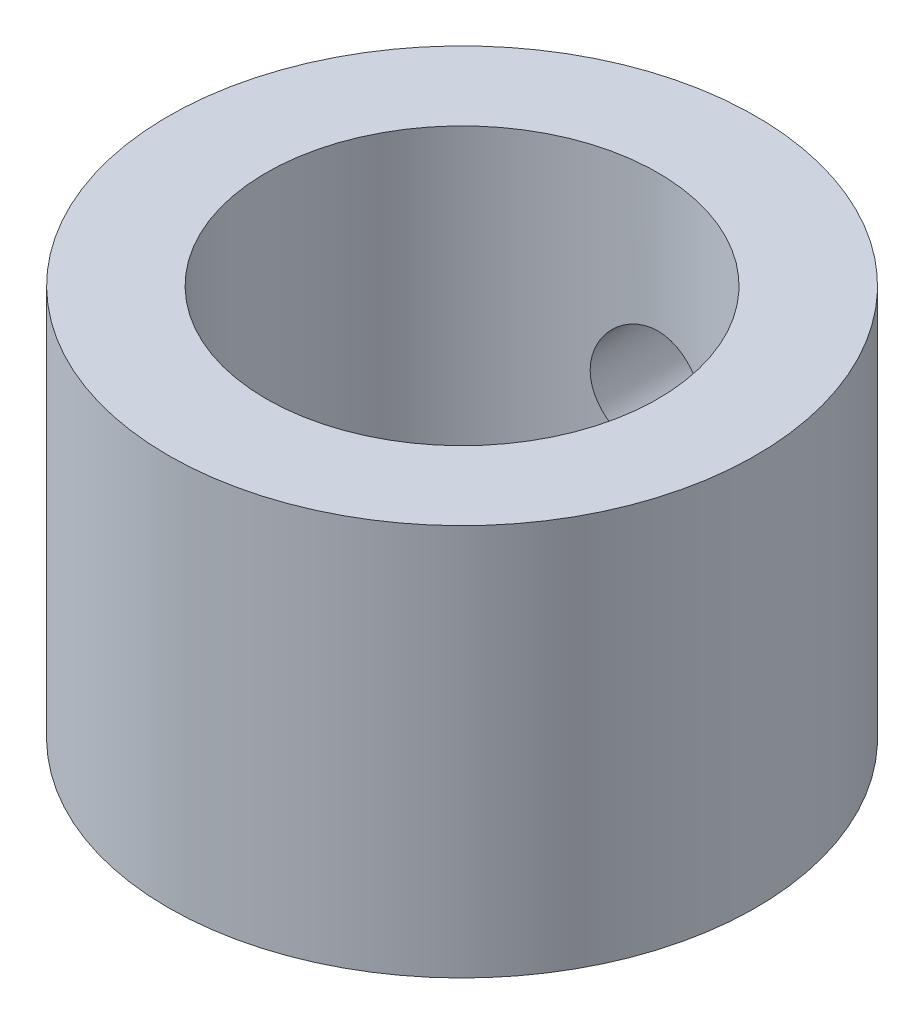
ISO-10303-21;
HEADER;
FILE_DESCRIPTION(('STEP AP214'),'2;1');
FILE_NAME('part.step','',(''),(''),'','','');
FILE_SCHEMA(('AUTOMOTIVE_DESIGN { 1 0 10303 214 1 1 1 1 }'));
ENDSEC;
DATA;
#1=APPLICATION_CONTEXT('core data for automotive mechanical design processes');
#2=APPLICATION_PROTOCOL_DEFINITION('international standard','automotive_design',2000,#1);
#3=PRODUCT_CONTEXT('',#1,'mechanical');
#4=PRODUCT('Part','Part','',(#3));
#5=PRODUCT_RELATED_PRODUCT_CATEGORY('part','',(#4));
#6=PRODUCT_DEFINITION_FORMATION('','',#4);
#7=PRODUCT_DEFINITION_CONTEXT('part definition',#1,'design');
#8=PRODUCT_DEFINITION('design','',#6,#7);
#9=PRODUCT_DEFINITION_SHAPE('','',#8);
#10=(LENGTH_UNIT() NAMED_UNIT(*) SI_UNIT(.MILLI.,.METRE.));
#11=(NAMED_UNIT(*) PLANE_ANGLE_UNIT() SI_UNIT($,.RADIAN.));
#12=(NAMED_UNIT(*) SI_UNIT($,.STERADIAN.) SOLID_ANGLE_UNIT());
#13=UNCERTAINTY_MEASURE_WITH_UNIT(LENGTH_MEASURE(1.E-05),#10,'distance_accuracy_value','');
#14=(GEOMETRIC_REPRESENTATION_CONTEXT(3) GLOBAL_UNCERTAINTY_ASSIGNED_CONTEXT((#13)) GLOBAL_UNIT_ASSIGNED_CONTEXT((#10,
#11,#12)) REPRESENTATION_CONTEXT('',''));
#15=CARTESIAN_POINT('',(0.,0.,0.));
#16=DIRECTION('',(0.,0.,1.));
#17=DIRECTION('',(1.,0.,0.));
#18=AXIS2_PLACEMENT_3D('',#15,#16,#17);
#19=CARTESIAN_POINT('',(0.,5.,0.));
#20=DIRECTION('',(0.,1.,0.));
#21=DIRECTION('',(0.,0.,1.));
#22=AXIS2_PLACEMENT_3D('',#19,#20,#21);
#23=PLANE('',#22);
#24=CARTESIAN_POINT('',(0.,5.,0.));
#25=DIRECTION('',(0.,1.,0.));
#26=DIRECTION('',(0.,0.,1.));
#27=AXIS2_PLACEMENT_3D('',#24,#25,#26);
#28=CIRCLE('',#27,7.5);
#29=CARTESIAN_POINT('',(0.,5.,7.5));
#30=VERTEX_POINT('',#29);
#31=EDGE_CURVE('E10',#30,#30,#28,.T.);
#32=ORIENTED_EDGE('',*,*,#31,.T.);
#33=EDGE_LOOP('',(#32));
#34=FACE_BOUND('',#33,.T.);
#35=CARTESIAN_POINT('',(0.,5.,0.));
#36=DIRECTION('',(0.,1.,0.));
#37=DIRECTION('',(0.,0.,1.));
#38=AXIS2_PLACEMENT_3D('',#35,#36,#37);
#39=CIRCLE('',#38,5.);
#40=CARTESIAN_POINT('',(0.,5.,5.));
#41=VERTEX_POINT('',#40);
#42=EDGE_CURVE('E47',#41,#41,#39,.T.);
#43=ORIENTED_EDGE('',*,*,#42,.F.);
#44=EDGE_LOOP('',(#43));
#45=FACE_BOUND('',#44,.T.);
#46=ADVANCED_FACE('F30',(#34,#45),#23,.T.);
#47=CARTESIAN_POINT('',(0.,-5.,0.));
#48=DIRECTION('',(0.,1.,0.));
#49=DIRECTION('',(0.,0.,1.));
#50=AXIS2_PLACEMENT_3D('',#47,#48,#49);
#51=PLANE('',#50);
#52=CARTESIAN_POINT('',(0.,-5.,0.));
#53=DIRECTION('',(0.,1.,0.));
#54=DIRECTION('',(0.,0.,1.));
#55=AXIS2_PLACEMENT_3D('',#52,#53,#54);
#56=CIRCLE('',#55,7.5);
#57=CARTESIAN_POINT('',(0.,-5.,7.5));
#58=VERTEX_POINT('',#57);
#59=EDGE_CURVE('E42',#58,#58,#56,.T.);
#60=ORIENTED_EDGE('',*,*,#59,.F.);
#61=EDGE_LOOP('',(#60));
#62=FACE_BOUND('',#61,.T.);
#63=CARTESIAN_POINT('',(0.,-5.,0.));
#64=DIRECTION('',(0.,1.,0.));
#65=DIRECTION('',(0.,0.,1.));
#66=AXIS2_PLACEMENT_3D('',#63,#64,#65);
#67=CIRCLE('',#66,5.);
#68=CARTESIAN_POINT('',(0.,-5.,5.));
#69=VERTEX_POINT('',#68);
#70=EDGE_CURVE('E49',#69,#69,#67,.T.);
#71=ORIENTED_EDGE('',*,*,#70,.T.);
#72=EDGE_LOOP('',(#71));
#73=FACE_BOUND('',#72,.T.);
#74=ADVANCED_FACE('F68',(#62,#73),#51,.F.);
#75=CARTESIAN_POINT('',(0.,5.,0.));
#76=DIRECTION('',(0.,-1.,0.));
#77=DIRECTION('',(0.,0.,-1.));
#78=AXIS2_PLACEMENT_3D('',#75,#76,#77);
#79=CYLINDRICAL_SURFACE('',#78,7.5);
#80=CARTESIAN_POINT('',(1.5,0.,-7.34846922834954));
#81=CARTESIAN_POINT('',(1.49999691881235,-0.0833465632357616,-7.34847088538349));
#82=CARTESIAN_POINT('',(1.49302975757707,-0.16673193499975,-7.34990262402619));
#83=CARTESIAN_POINT('',(1.46536842537441,-0.331143757714958,-7.35546646957747));
#84=CARTESIAN_POINT('',(1.44466327060578,-0.41216826695404,-7.35960073717297));
#85=CARTESIAN_POINT('',(1.39019367392958,-0.569455955031247,-7.37008310582666));
#86=CARTESIAN_POINT('',(1.35644222122892,-0.645723782298866,-7.37642900431582));
#87=CARTESIAN_POINT('',(1.27687366150577,-0.791512267045452,-7.39061699221019));
#88=CARTESIAN_POINT('',(1.23105722790173,-0.861033300806858,-7.398458998102));
#89=CARTESIAN_POINT('',(1.12796861348015,-0.992341505780786,-7.4148794954137));
#90=CARTESIAN_POINT('',(1.07055848386998,-1.05401938182596,-7.42346606755867));
#91=CARTESIAN_POINT('',(0.946210183531966,-1.16693630036847,-7.440337084539));
#92=CARTESIAN_POINT('',(0.879271345466976,-1.21817461112579,-7.44862150816248));
#93=CARTESIAN_POINT('',(0.737042033886383,-1.30918202644269,-7.46404194626342));
#94=CARTESIAN_POINT('',(0.661683851508316,-1.34884727072496,-7.47116732162326));
#95=CARTESIAN_POINT('',(0.505206225580907,-1.41491240557221,-7.48337605325447));
#96=CARTESIAN_POINT('',(0.424087322130829,-1.44131353785149,-7.48845960066179));
#97=CARTESIAN_POINT('',(0.259525159917741,-1.47976079042944,-7.49595481032628));
#98=CARTESIAN_POINT('',(0.176126608822221,-1.49199146635651,-7.49840079432191));
#99=CARTESIAN_POINT('',(0.0084278526563047,-1.50232642775747,-7.50046381775405));
#100=CARTESIAN_POINT('',(-0.0758722647477646,-1.50043207446873,-7.50008112979138));
#101=CARTESIAN_POINT('',(-0.241713001115383,-1.48271072967667,-7.49655652302773));
#102=CARTESIAN_POINT('',(-0.323275821447705,-1.46708253424823,-7.49345397548757));
#103=CARTESIAN_POINT('',(-0.482597439870452,-1.42265245131166,-7.48488265739113));
#104=CARTESIAN_POINT('',(-0.560356085620694,-1.39385003671219,-7.47941379216059));
#105=CARTESIAN_POINT('',(-0.710429194801331,-1.3237049397791,-7.46665944029938));
#106=CARTESIAN_POINT('',(-0.78270626120085,-1.28228437334267,-7.45936272262835));
#107=CARTESIAN_POINT('',(-0.919357568789634,-1.1881363841451,-7.44375704210678));
#108=CARTESIAN_POINT('',(-0.983730899287501,-1.13540766034423,-7.43544796282833));
#109=CARTESIAN_POINT('',(-1.10392714658019,-1.01904956683729,-7.4185644654669));
#110=CARTESIAN_POINT('',(-1.15958147486045,-0.955246219905615,-7.40998794686274));
#111=CARTESIAN_POINT('',(-1.25942773976521,-0.819125336323872,-7.39367357398141));
#112=CARTESIAN_POINT('',(-1.30361945959163,-0.746807638675207,-7.38593573556822));
#113=CARTESIAN_POINT('',(-1.37934422220282,-0.595468752267293,-7.37217071209386));
#114=CARTESIAN_POINT('',(-1.41084997166656,-0.516433548540508,-7.36614722345324));
#115=CARTESIAN_POINT('',(-1.46008551244137,-0.354043014414014,-7.35654714481909));
#116=CARTESIAN_POINT('',(-1.47781709918496,-0.270688248571374,-7.35297023592642));
#117=CARTESIAN_POINT('',(-1.49874900905408,-0.103552713001433,-7.34873218901742));
#118=CARTESIAN_POINT('',(-1.50219278834687,-0.0198036385344892,-7.34802220585731));
#119=CARTESIAN_POINT('',(-1.49510644246611,0.147072334799525,-7.34946728533281));
#120=CARTESIAN_POINT('',(-1.48457710968366,0.230199268678295,-7.35162218550582));
#121=CARTESIAN_POINT('',(-1.45005331211124,0.392652960438353,-7.35850848742372));
#122=CARTESIAN_POINT('',(-1.42618893125895,0.472008514553644,-7.36321498521745));
#123=CARTESIAN_POINT('',(-1.36581155296278,0.625594918543112,-7.37465234027497));
#124=CARTESIAN_POINT('',(-1.32929751355977,0.699825345653581,-7.38138336429404));
#125=CARTESIAN_POINT('',(-1.2441062133234,0.842119664925242,-7.39622108943059));
#126=CARTESIAN_POINT('',(-1.19527661697413,0.91009056945124,-7.40434457797355));
#127=CARTESIAN_POINT('',(-1.08704335831907,1.03696246800137,-7.42100585739955));
#128=CARTESIAN_POINT('',(-1.02763860771681,1.09586252737388,-7.42954369085727));
#129=CARTESIAN_POINT('',(-0.898848410246836,1.20384383877837,-7.44623018803823));
#130=CARTESIAN_POINT('',(-0.829323748394445,1.25276048197499,-7.45437086563026));
#131=CARTESIAN_POINT('',(-0.682901844952133,1.33821882224938,-7.4692069144293));
#132=CARTESIAN_POINT('',(-0.606004913150261,1.37476103901717,-7.47590234632816));
#133=CARTESIAN_POINT('',(-0.447454021236019,1.43419330761995,-7.487059410916));
#134=CARTESIAN_POINT('',(-0.365830010217117,1.45716077733938,-7.49153368713907));
#135=CARTESIAN_POINT('',(-0.199784182019869,1.48903687149577,-7.4977985390649));
#136=CARTESIAN_POINT('',(-0.115362703066821,1.49794718921352,-7.49958943799765));
#137=CARTESIAN_POINT('',(0.0523093408554348,1.50139047144433,-7.50027810681181));
#138=CARTESIAN_POINT('',(0.135554718212253,1.49617092068432,-7.49922567824026));
#139=CARTESIAN_POINT('',(0.299956546973462,1.47204907417828,-7.49445065340477));
#140=CARTESIAN_POINT('',(0.381113024630536,1.45314695047789,-7.49072809071528));
#141=CARTESIAN_POINT('',(0.538879124617644,1.40230651186253,-7.481032475475));
#142=CARTESIAN_POINT('',(0.61549866486042,1.37039793280322,-7.47506455871866));
#143=CARTESIAN_POINT('',(0.762331830278928,1.29448163800365,-7.46152083185077));
#144=CARTESIAN_POINT('',(0.832544948651117,1.25047296614443,-7.45394489468828));
#145=CARTESIAN_POINT('',(0.965795835159535,1.15077091940688,-7.43786398736791));
#146=CARTESIAN_POINT('',(1.02869957417475,1.09490049541984,-7.4293460013317));
#147=CARTESIAN_POINT('',(1.14432392663527,0.973424639856349,-7.41241834355477));
#148=CARTESIAN_POINT('',(1.19704212480408,0.907816905796931,-7.40400869794476));
#149=CARTESIAN_POINT('',(1.29133832918279,0.767881024949695,-7.3881501412478));
#150=CARTESIAN_POINT('',(1.33279022195961,0.693466558259309,-7.38071255446371));
#151=CARTESIAN_POINT('',(1.40253607393175,0.538600840050603,-7.36777855777287));
#152=CARTESIAN_POINT('',(1.43084196896908,0.458155141953656,-7.36228038807749));
#153=CARTESIAN_POINT('',(1.4680037097813,0.314606316844753,-7.3549452169166));
#154=CARTESIAN_POINT('',(1.47998084778413,0.252321870731514,-7.35253177367824));
#155=CARTESIAN_POINT('',(1.49598002694097,0.126699068170847,-7.34929317692711));
#156=CARTESIAN_POINT('',(1.50000234234439,0.0633607481325583,-7.34846796865859));
#157=CARTESIAN_POINT('',(1.5,0.,-7.34846922834954));
#158=B_SPLINE_CURVE_WITH_KNOTS('',3,(#80,#81,#82,#83,#84,#85,#86,#87,#88,#89,#90,#91,#92,#93,
#94,#95,#96,#97,#98,#99,#100,#101,#102,#103,#104,#105,#106,#107,#108,#109,#110,#111,#112,#113,
#114,#115,#116,#117,#118,#119,#120,#121,#122,#123,#124,#125,#126,#127,#128,#129,#130,#131,#132,
#133,#134,#135,#136,#137,#138,#139,#140,#141,#142,#143,#144,#145,#146,#147,#148,#149,#150,#151,
#152,#153,#154,#155,#156,#157),.UNSPECIFIED.,.T.,.F.,(4,2,2,2,2,2,2,2,2,2,2,2,2,2,2,2,2,2,2,2,2,
2,2,2,2,2,2,2,2,2,2,2,2,2,2,2,2,2,4),(0.,0.249807695804142,0.499815358926445,0.749574746910879,
0.999320197289796,1.25223378822655,1.50516510053133,1.76030100656175,2.0154130236984,
2.26716373324621,2.51889018174372,2.76703184450306,3.01518343610625,3.26489886333455,
3.51464303655099,3.76874020143725,4.0228421718408,4.27748794759165,4.53210052524037,
4.7823563670689,5.03259801792632,5.28044012674978,5.52830265531598,5.77939589661782,
6.03051499305313,6.28548902600176,6.54045234945157,6.79394720367975,7.04741152037442,
7.29646526122029,7.54551587050135,7.79400025613178,8.04250428202026,8.29501728038395,
8.54759008334672,8.80288347868562,9.05794462633399,9.24785705455344,9.43776293526322),.UNSPECIFIED.);
#159=CARTESIAN_POINT('',(1.5,0.,-7.34846922834954));
#160=VERTEX_POINT('',#159);
#161=EDGE_CURVE('E54',#160,#160,#158,.T.);
#162=ORIENTED_EDGE('',*,*,#161,.F.);
#163=EDGE_LOOP('',(#162));
#164=FACE_BOUND('',#163,.T.);
#165=ORIENTED_EDGE('',*,*,#31,.F.);
#166=EDGE_LOOP('',(#165));
#167=FACE_BOUND('',#166,.T.);
#168=ORIENTED_EDGE('',*,*,#59,.T.);
#169=EDGE_LOOP('',(#168));
#170=FACE_BOUND('',#169,.T.);
#171=ADVANCED_FACE('F32',(#164,#167,#170),#79,.T.);
#172=CARTESIAN_POINT('',(0.,5.,0.));
#173=DIRECTION('',(0.,-1.,0.));
#174=DIRECTION('',(0.,0.,-1.));
#175=AXIS2_PLACEMENT_3D('',#172,#173,#174);
#176=CYLINDRICAL_SURFACE('',#175,5.);
#177=CARTESIAN_POINT('',(0.,1.5,-5.));
#178=CARTESIAN_POINT('',(-0.0822886127533,1.49999900251511,-4.9999992925055));
#179=CARTESIAN_POINT('',(-0.164587318351529,1.49320613637603,-4.99794915693954));
#180=CARTESIAN_POINT('',(-0.326788125304881,1.4662786457779,-4.98997105593691));
#181=CARTESIAN_POINT('',(-0.40668950441142,1.44614004197666,-4.98404193389692));
#182=CARTESIAN_POINT('',(-0.561732707754526,1.39325398308974,-4.96895552501836));
#183=CARTESIAN_POINT('',(-0.636881364395373,1.36052513038106,-4.95980300250425));
#184=CARTESIAN_POINT('',(-0.780624181053131,1.28346390694416,-4.93922109237645));
#185=CARTESIAN_POINT('',(-0.849217467469669,1.23912999260458,-4.92779140192067));
#186=CARTESIAN_POINT('',(-0.979871797183745,1.13877599252733,-4.90350737192774));
#187=CARTESIAN_POINT('',(-1.04171807124434,1.08248337411409,-4.89062383657036));
#188=CARTESIAN_POINT('',(-1.15524920923324,0.960390770089816,-4.86505834210442));
#189=CARTESIAN_POINT('',(-1.20693236327441,0.89458918787504,-4.85237641724501));
#190=CARTESIAN_POINT('',(-1.29980037723708,0.753529246962388,-4.82834113993772));
#191=CARTESIAN_POINT('',(-1.34072309022213,0.678091539009262,-4.81702406663875));
#192=CARTESIAN_POINT('',(-1.4092139477476,0.521010745769707,-4.79743620394031));
#193=CARTESIAN_POINT('',(-1.43678529919973,0.439369156072024,-4.78916468313311));
#194=CARTESIAN_POINT('',(-1.47701633682652,0.27460973386954,-4.77690870838434));
#195=CARTESIAN_POINT('',(-1.49007196234677,0.191597256136057,-4.77281069324533));
#196=CARTESIAN_POINT('',(-1.50213730614672,0.0244668437832342,-4.76902789749767));
#197=CARTESIAN_POINT('',(-1.50115042761078,-0.0596508180590879,-4.76934204760571));
#198=CARTESIAN_POINT('',(-1.48546977199812,-0.223383908608484,-4.77424744067778));
#199=CARTESIAN_POINT('',(-1.47127205262685,-0.303052250362239,-4.7786838859914));
#200=CARTESIAN_POINT('',(-1.43037420427056,-0.458819786273461,-4.79108356228624));
#201=CARTESIAN_POINT('',(-1.40367284141641,-0.534918627374333,-4.79904714132351));
#202=CARTESIAN_POINT('',(-1.33816026653682,-0.68260034966074,-4.81772733074973));
#203=CARTESIAN_POINT('',(-1.29918816934642,-0.754107083955263,-4.82848016115952));
#204=CARTESIAN_POINT('',(-1.21035222588683,-0.889732022010193,-4.85150987000065));
#205=CARTESIAN_POINT('',(-1.16048574002588,-0.953848429413778,-4.86378711746991));
#206=CARTESIAN_POINT('',(-1.04881290765546,-1.07568619076202,-4.88911011297937));
#207=CARTESIAN_POINT('',(-0.986594907466972,-1.13302866402967,-4.90216654310498));
#208=CARTESIAN_POINT('',(-0.853263259313967,-1.23655398406425,-4.92712244063259));
#209=CARTESIAN_POINT('',(-0.782149051860887,-1.28273612841443,-4.9390218351841));
#210=CARTESIAN_POINT('',(-0.632355038342802,-1.36285992246473,-4.9604316006947));
#211=CARTESIAN_POINT('',(-0.553627749747949,-1.39671751624986,-4.96992543668314));
#212=CARTESIAN_POINT('',(-0.391245415603518,-1.45059959009963,-4.98533521832222));
#213=CARTESIAN_POINT('',(-0.307591751589581,-1.47062792853249,-4.99125216186999));
#214=CARTESIAN_POINT('',(-0.140952242668331,-1.49565217789939,-4.99868364643538));
#215=CARTESIAN_POINT('',(-0.0580500976011865,-1.50116158580161,-5.0003485041779));
#216=CARTESIAN_POINT('',(0.107499605823383,-1.49843084428792,-4.9995292324176));
#217=CARTESIAN_POINT('',(0.190147196690781,-1.49019253034856,-4.99704565677756));
#218=CARTESIAN_POINT('',(0.350903605309697,-1.4606153888885,-4.98830696987163));
#219=CARTESIAN_POINT('',(0.429072772614169,-1.43957661241913,-4.98213829799417));
#220=CARTESIAN_POINT('',(0.580754638954522,-1.3853567672218,-4.96674347841533));
#221=CARTESIAN_POINT('',(0.654266777025584,-1.35217423896214,-4.95751696321085));
#222=CARTESIAN_POINT('',(0.796437189461053,-1.27374683451887,-4.93669654351325));
#223=CARTESIAN_POINT('',(0.86494382619967,-1.22824065905203,-4.92505280829675));
#224=CARTESIAN_POINT('',(0.993523307980147,-1.12677524594719,-4.90073468764318));
#225=CARTESIAN_POINT('',(1.05359403235593,-1.07081338811233,-4.8880600443108));
#226=CARTESIAN_POINT('',(1.16585744551027,-0.947612691630654,-4.86253171869138));
#227=CARTESIAN_POINT('',(1.21768481231504,-0.880038124228263,-4.84968825033268));
#228=CARTESIAN_POINT('',(1.30928995072154,-0.736872060986467,-4.82576515238463));
#229=CARTESIAN_POINT('',(1.34906803829472,-0.661280775441786,-4.81468547654651));
#230=CARTESIAN_POINT('',(1.41517347127168,-0.504467508745312,-4.79567189615055));
#231=CARTESIAN_POINT('',(1.4415634693705,-0.423273813463409,-4.78772337843827));
#232=CARTESIAN_POINT('',(1.48021730815114,-0.257312031068522,-4.77591594362794));
#233=CARTESIAN_POINT('',(1.49248598978779,-0.172545179212331,-4.772055625083));
#234=CARTESIAN_POINT('',(1.50221984485059,-0.00563848162377221,-4.76899972496087));
#235=CARTESIAN_POINT('',(1.5002805530849,0.0764636510175858,-4.76961647442754));
#236=CARTESIAN_POINT('',(1.48307505444813,0.2391141033728,-4.77499401288294));
#237=CARTESIAN_POINT('',(1.46780938124716,0.319662485176353,-4.77975463592551));
#238=CARTESIAN_POINT('',(1.42476888804136,0.475945399142852,-4.79275763670386));
#239=CARTESIAN_POINT('',(1.39715175507068,0.551727287361693,-4.80095604545965));
#240=CARTESIAN_POINT('',(1.33031507121129,0.697642438817723,-4.81990278909136));
#241=CARTESIAN_POINT('',(1.29109329962876,0.767774617640757,-4.83065161194312));
#242=CARTESIAN_POINT('',(1.20048763805072,0.903163116527113,-4.85397676425833));
#243=CARTESIAN_POINT('',(1.14871276092994,0.968148761260411,-4.86660540163798));
#244=CARTESIAN_POINT('',(1.03517434629782,1.08870249830786,-4.89201320450026));
#245=CARTESIAN_POINT('',(0.973408217134502,1.14426813946776,-4.90479240823905));
#246=CARTESIAN_POINT('',(0.839465762183249,1.24602341229503,-4.92950936570649));
#247=CARTESIAN_POINT('',(0.767037885790608,1.29189144685549,-4.94141159765674));
#248=CARTESIAN_POINT('',(0.61514137398353,1.37073516990402,-4.96260680455813));
#249=CARTESIAN_POINT('',(0.535676052998955,1.40371688827451,-4.97190099931067));
#250=CARTESIAN_POINT('',(0.380757712655282,1.45289527565275,-4.98602174969301));
#251=CARTESIAN_POINT('',(0.305786961954234,1.47051167288325,-4.99122027381068));
#252=CARTESIAN_POINT('',(0.15388019523078,1.49406352524158,-4.99820944494492));
#253=CARTESIAN_POINT('',(0.0769445098581396,1.50000093270482,-5.0000006615474));
#254=CARTESIAN_POINT('',(0.,1.5,-5.));
#255=B_SPLINE_CURVE_WITH_KNOTS('',3,(#177,#178,#179,#180,#181,#182,#183,#184,#185,#186,#187,
#188,#189,#190,#191,#192,#193,#194,#195,#196,#197,#198,#199,#200,#201,#202,#203,#204,#205,#206,
#207,#208,#209,#210,#211,#212,#213,#214,#215,#216,#217,#218,#219,#220,#221,#222,#223,#224,#225,
#226,#227,#228,#229,#230,#231,#232,#233,#234,#235,#236,#237,#238,#239,#240,#241,#242,#243,#244,
#245,#246,#247,#248,#249,#250,#251,#252,#253,#254),.UNSPECIFIED.,.T.,.F.,(4,2,2,2,2,2,2,2,2,2,2,
2,2,2,2,2,2,2,2,2,2,2,2,2,2,2,2,2,2,2,2,2,2,2,2,2,2,2,4),(0.,0.246583203612611,0.493239964846,
0.739533676300874,0.985860164412702,1.23855602948191,1.49129437288633,1.74971481004109,
2.00807314543224,2.25919689356599,2.51025978319089,2.75226016697676,2.99428443658001,
3.2396242644712,3.48502360158555,3.74067104048167,3.99633456531072,4.25371046881689,
4.51101453528808,4.75908809438545,5.00712853550327,5.24956746682327,5.49203554593729,
5.74011305702908,5.98825282000191,6.24540400322819,6.50254844252681,6.75847814951252,
7.01432009460283,7.25950155466943,7.504673196616,7.74680040402721,7.98897397553107,
8.23996925679931,8.49102974897502,8.74942996156671,9.00770911595235,9.2383169193046,
9.46888616948875),.UNSPECIFIED.);
#256=CARTESIAN_POINT('',(0.,1.5,-5.));
#257=VERTEX_POINT('',#256);
#258=EDGE_CURVE('E34',#257,#257,#255,.T.);
#259=ORIENTED_EDGE('',*,*,#258,.F.);
#260=EDGE_LOOP('',(#259));
#261=FACE_BOUND('',#260,.T.);
#262=ORIENTED_EDGE('',*,*,#42,.T.);
#263=EDGE_LOOP('',(#262));
#264=FACE_BOUND('',#263,.T.);
#265=ORIENTED_EDGE('',*,*,#70,.F.);
#266=EDGE_LOOP('',(#265));
#267=FACE_BOUND('',#266,.T.);
#268=ADVANCED_FACE('F62',(#261,#264,#267),#176,.F.);
#269=CARTESIAN_POINT('',(0.,0.,-7.501));
#270=DIRECTION('',(0.,0.,1.));
#271=DIRECTION('',(1.,0.,0.));
#272=AXIS2_PLACEMENT_3D('',#269,#270,#271);
#273=CYLINDRICAL_SURFACE('',#272,1.5);
#274=ORIENTED_EDGE('',*,*,#258,.T.);
#275=EDGE_LOOP('',(#274));
#276=FACE_BOUND('',#275,.T.);
#277=ORIENTED_EDGE('',*,*,#161,.T.);
#278=EDGE_LOOP('',(#277));
#279=FACE_BOUND('',#278,.T.);
#280=ADVANCED_FACE('F59',(#276,#279),#273,.F.);
#281=CLOSED_SHELL('',(#46,#74,#171,#268,#280));
#282=MANIFOLD_SOLID_BREP('B2',#281);
#283=ADVANCED_BREP_SHAPE_REPRESENTATION('',(#18,#282),#14);
#284=SHAPE_DEFINITION_REPRESENTATION(#9,#283);
ENDSEC;
END-ISO-10303-21;
